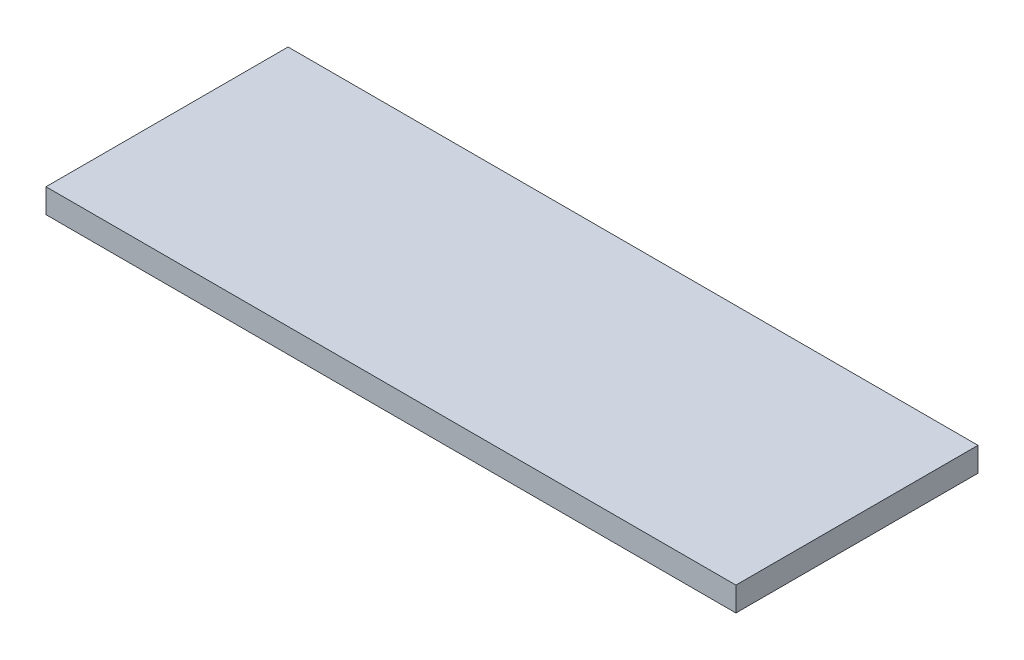
ISO-10303-21;
HEADER;
FILE_DESCRIPTION(('STEP AP214'),'2;1');
FILE_NAME('part.step','',(''),(''),'','','');
FILE_SCHEMA(('AUTOMOTIVE_DESIGN { 1 0 10303 214 1 1 1 1 }'));
ENDSEC;
DATA;
#1=APPLICATION_CONTEXT('core data for automotive mechanical design processes');
#2=APPLICATION_PROTOCOL_DEFINITION('international standard','automotive_design',2000,#1);
#3=PRODUCT_CONTEXT('',#1,'mechanical');
#4=PRODUCT('Part','Part','',(#3));
#5=PRODUCT_RELATED_PRODUCT_CATEGORY('part','',(#4));
#6=PRODUCT_DEFINITION_FORMATION('','',#4);
#7=PRODUCT_DEFINITION_CONTEXT('part definition',#1,'design');
#8=PRODUCT_DEFINITION('design','',#6,#7);
#9=PRODUCT_DEFINITION_SHAPE('','',#8);
#10=(LENGTH_UNIT() NAMED_UNIT(*) SI_UNIT(.MILLI.,.METRE.));
#11=(NAMED_UNIT(*) PLANE_ANGLE_UNIT() SI_UNIT($,.RADIAN.));
#12=(NAMED_UNIT(*) SI_UNIT($,.STERADIAN.) SOLID_ANGLE_UNIT());
#13=UNCERTAINTY_MEASURE_WITH_UNIT(LENGTH_MEASURE(1.E-05),#10,'distance_accuracy_value','');
#14=(GEOMETRIC_REPRESENTATION_CONTEXT(3) GLOBAL_UNCERTAINTY_ASSIGNED_CONTEXT((#13)) GLOBAL_UNIT_ASSIGNED_CONTEXT((#10,
#11,#12)) REPRESENTATION_CONTEXT('',''));
#15=CARTESIAN_POINT('',(0.,0.,0.));
#16=DIRECTION('',(0.,0.,1.));
#17=DIRECTION('',(1.,0.,0.));
#18=AXIS2_PLACEMENT_3D('',#15,#16,#17);
#19=CARTESIAN_POINT('',(-44.3111111111111,14.3555555555555,5.25));
#20=DIRECTION('',(1.,0.,0.));
#21=DIRECTION('',(0.,0.,1.));
#22=AXIS2_PLACEMENT_3D('',#19,#20,#21);
#23=PLANE('',#22);
#24=DIRECTION('',(0.,0.,-1.));
#25=VECTOR('',#24,1.);
#26=CARTESIAN_POINT('',(-44.3111111111111,15.3555555555555,5.25));
#27=LINE('',#26,#25);
#28=CARTESIAN_POINT('',(-44.3111111111111,15.3555555555555,5.25));
#29=VERTEX_POINT('',#28);
#30=CARTESIAN_POINT('',(-44.3111111111111,15.3555555555556,-4.75));
#31=VERTEX_POINT('',#30);
#32=EDGE_CURVE('E98',#29,#31,#27,.T.);
#33=ORIENTED_EDGE('',*,*,#32,.T.);
#34=DIRECTION('',(0.,1.,0.));
#35=VECTOR('',#34,1.);
#36=CARTESIAN_POINT('',(-44.3111111111111,14.3555555555556,-4.75));
#37=LINE('',#36,#35);
#38=CARTESIAN_POINT('',(-44.3111111111111,14.3555555555556,-4.75));
#39=VERTEX_POINT('',#38);
#40=EDGE_CURVE('E11',#39,#31,#37,.T.);
#41=ORIENTED_EDGE('',*,*,#40,.F.);
#42=DIRECTION('',(0.,0.,-1.));
#43=VECTOR('',#42,1.);
#44=CARTESIAN_POINT('',(-44.3111111111111,14.3555555555555,5.25));
#45=LINE('',#44,#43);
#46=CARTESIAN_POINT('',(-44.3111111111111,14.3555555555555,5.25));
#47=VERTEX_POINT('',#46);
#48=EDGE_CURVE('E86',#47,#39,#45,.T.);
#49=ORIENTED_EDGE('',*,*,#48,.F.);
#50=DIRECTION('',(0.,1.,0.));
#51=VECTOR('',#50,1.);
#52=CARTESIAN_POINT('',(-44.3111111111111,14.3555555555555,5.25));
#53=LINE('',#52,#51);
#54=EDGE_CURVE('E94',#47,#29,#53,.T.);
#55=ORIENTED_EDGE('',*,*,#54,.T.);
#56=EDGE_LOOP('',(#33,#41,#49,#55));
#57=FACE_BOUND('',#56,.T.);
#58=ADVANCED_FACE('F35',(#57),#23,.F.);
#59=CARTESIAN_POINT('',(-44.3111111111111,14.3555555555556,-4.75));
#60=DIRECTION('',(0.,0.,1.));
#61=DIRECTION('',(0.,-1.,0.));
#62=AXIS2_PLACEMENT_3D('',#59,#60,#61);
#63=PLANE('',#62);
#64=DIRECTION('',(1.,0.,0.));
#65=VECTOR('',#64,1.);
#66=CARTESIAN_POINT('',(-44.3111111111111,15.3555555555556,-4.75));
#67=LINE('',#66,#65);
#68=CARTESIAN_POINT('',(-15.8111111111111,15.3555555555556,-4.75));
#69=VERTEX_POINT('',#68);
#70=EDGE_CURVE('E90',#31,#69,#67,.T.);
#71=ORIENTED_EDGE('',*,*,#70,.T.);
#72=DIRECTION('',(0.,1.,0.));
#73=VECTOR('',#72,1.);
#74=CARTESIAN_POINT('',(-15.8111111111111,14.3555555555556,-4.75));
#75=LINE('',#74,#73);
#76=CARTESIAN_POINT('',(-15.8111111111111,14.3555555555556,-4.75));
#77=VERTEX_POINT('',#76);
#78=EDGE_CURVE('E43',#77,#69,#75,.T.);
#79=ORIENTED_EDGE('',*,*,#78,.F.);
#80=DIRECTION('',(1.,0.,0.));
#81=VECTOR('',#80,1.);
#82=CARTESIAN_POINT('',(-44.3111111111111,14.3555555555556,-4.75));
#83=LINE('',#82,#81);
#84=EDGE_CURVE('E81',#39,#77,#83,.T.);
#85=ORIENTED_EDGE('',*,*,#84,.F.);
#86=ORIENTED_EDGE('',*,*,#40,.T.);
#87=EDGE_LOOP('',(#71,#79,#85,#86));
#88=FACE_BOUND('',#87,.T.);
#89=ADVANCED_FACE('F89',(#88),#63,.F.);
#90=CARTESIAN_POINT('',(-15.8111111111111,14.3555555555555,5.25));
#91=DIRECTION('',(-1.,0.,0.));
#92=DIRECTION('',(0.,0.,-1.));
#93=AXIS2_PLACEMENT_3D('',#90,#91,#92);
#94=PLANE('',#93);
#95=DIRECTION('',(0.,0.,1.));
#96=VECTOR('',#95,1.);
#97=CARTESIAN_POINT('',(-15.8111111111111,15.3555555555555,5.25));
#98=LINE('',#97,#96);
#99=CARTESIAN_POINT('',(-15.8111111111111,15.3555555555555,5.25));
#100=VERTEX_POINT('',#99);
#101=EDGE_CURVE('E68',#69,#100,#98,.T.);
#102=ORIENTED_EDGE('',*,*,#101,.T.);
#103=DIRECTION('',(0.,1.,0.));
#104=VECTOR('',#103,1.);
#105=CARTESIAN_POINT('',(-15.8111111111111,14.3555555555555,5.25));
#106=LINE('',#105,#104);
#107=CARTESIAN_POINT('',(-15.8111111111111,14.3555555555555,5.25));
#108=VERTEX_POINT('',#107);
#109=EDGE_CURVE('E91',#108,#100,#106,.T.);
#110=ORIENTED_EDGE('',*,*,#109,.F.);
#111=DIRECTION('',(0.,0.,1.));
#112=VECTOR('',#111,1.);
#113=CARTESIAN_POINT('',(-15.8111111111111,14.3555555555555,5.25));
#114=LINE('',#113,#112);
#115=EDGE_CURVE('E84',#77,#108,#114,.T.);
#116=ORIENTED_EDGE('',*,*,#115,.F.);
#117=ORIENTED_EDGE('',*,*,#78,.T.);
#118=EDGE_LOOP('',(#102,#110,#116,#117));
#119=FACE_BOUND('',#118,.T.);
#120=ADVANCED_FACE('F92',(#119),#94,.F.);
#121=CARTESIAN_POINT('',(-44.3111111111111,14.3555555555555,5.25));
#122=DIRECTION('',(0.,0.,-1.));
#123=DIRECTION('',(0.,1.,0.));
#124=AXIS2_PLACEMENT_3D('',#121,#122,#123);
#125=PLANE('',#124);
#126=DIRECTION('',(-1.,0.,0.));
#127=VECTOR('',#126,1.);
#128=CARTESIAN_POINT('',(-44.3111111111111,15.3555555555555,5.25));
#129=LINE('',#128,#127);
#130=EDGE_CURVE('E74',#100,#29,#129,.T.);
#131=ORIENTED_EDGE('',*,*,#130,.T.);
#132=ORIENTED_EDGE('',*,*,#54,.F.);
#133=DIRECTION('',(-1.,0.,0.));
#134=VECTOR('',#133,1.);
#135=CARTESIAN_POINT('',(-44.3111111111111,14.3555555555555,5.25));
#136=LINE('',#135,#134);
#137=EDGE_CURVE('E51',#108,#47,#136,.T.);
#138=ORIENTED_EDGE('',*,*,#137,.F.);
#139=ORIENTED_EDGE('',*,*,#109,.T.);
#140=EDGE_LOOP('',(#131,#132,#138,#139));
#141=FACE_BOUND('',#140,.T.);
#142=ADVANCED_FACE('F105',(#141),#125,.F.);
#143=CARTESIAN_POINT('',(0.,14.3555555555556,-14.8555555555556));
#144=DIRECTION('',(0.,-1.,0.));
#145=DIRECTION('',(1.,0.,0.));
#146=AXIS2_PLACEMENT_3D('',#143,#144,#145);
#147=PLANE('',#146);
#148=ORIENTED_EDGE('',*,*,#48,.T.);
#149=ORIENTED_EDGE('',*,*,#84,.T.);
#150=ORIENTED_EDGE('',*,*,#115,.T.);
#151=ORIENTED_EDGE('',*,*,#137,.T.);
#152=EDGE_LOOP('',(#148,#149,#150,#151));
#153=FACE_BOUND('',#152,.T.);
#154=ADVANCED_FACE('F82',(#153),#147,.T.);
#155=CARTESIAN_POINT('',(0.,15.3555555555556,-14.8555555555555));
#156=DIRECTION('',(0.,-1.,0.));
#157=DIRECTION('',(1.,0.,0.));
#158=AXIS2_PLACEMENT_3D('',#155,#156,#157);
#159=PLANE('',#158);
#160=ORIENTED_EDGE('',*,*,#32,.F.);
#161=ORIENTED_EDGE('',*,*,#130,.F.);
#162=ORIENTED_EDGE('',*,*,#101,.F.);
#163=ORIENTED_EDGE('',*,*,#70,.F.);
#164=EDGE_LOOP('',(#160,#161,#162,#163));
#165=FACE_BOUND('',#164,.T.);
#166=ADVANCED_FACE('F108',(#165),#159,.F.);
#167=CLOSED_SHELL('',(#58,#89,#120,#142,#154,#166));
#168=MANIFOLD_SOLID_BREP('B2',#167);
#169=ADVANCED_BREP_SHAPE_REPRESENTATION('',(#18,#168),#14);
#170=SHAPE_DEFINITION_REPRESENTATION(#9,#169);
ENDSEC;
END-ISO-10303-21;
